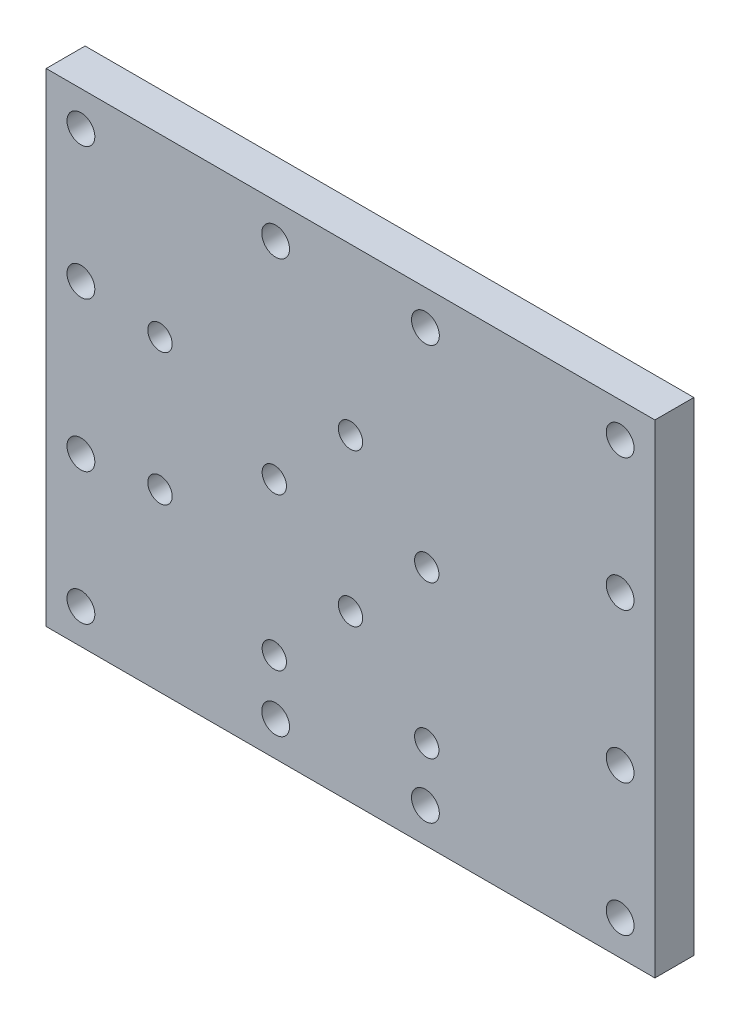
ISO-10303-21;
HEADER;
FILE_DESCRIPTION(('STEP AP214'),'2;1');
FILE_NAME('part.step','',(''),(''),'','','');
FILE_SCHEMA(('AUTOMOTIVE_DESIGN { 1 0 10303 214 1 1 1 1 }'));
ENDSEC;
DATA;
#1=APPLICATION_CONTEXT('core data for automotive mechanical design processes');
#2=APPLICATION_PROTOCOL_DEFINITION('international standard','automotive_design',2000,#1);
#3=PRODUCT_CONTEXT('',#1,'mechanical');
#4=PRODUCT('Part','Part','',(#3));
#5=PRODUCT_RELATED_PRODUCT_CATEGORY('part','',(#4));
#6=PRODUCT_DEFINITION_FORMATION('','',#4);
#7=PRODUCT_DEFINITION_CONTEXT('part definition',#1,'design');
#8=PRODUCT_DEFINITION('design','',#6,#7);
#9=PRODUCT_DEFINITION_SHAPE('','',#8);
#10=(LENGTH_UNIT() NAMED_UNIT(*) SI_UNIT(.MILLI.,.METRE.));
#11=(NAMED_UNIT(*) PLANE_ANGLE_UNIT() SI_UNIT($,.RADIAN.));
#12=(NAMED_UNIT(*) SI_UNIT($,.STERADIAN.) SOLID_ANGLE_UNIT());
#13=UNCERTAINTY_MEASURE_WITH_UNIT(LENGTH_MEASURE(1.E-05),#10,'distance_accuracy_value','');
#14=(GEOMETRIC_REPRESENTATION_CONTEXT(3) GLOBAL_UNCERTAINTY_ASSIGNED_CONTEXT((#13)) GLOBAL_UNIT_ASSIGNED_CONTEXT((#10,
#11,#12)) REPRESENTATION_CONTEXT('',''));
#15=CARTESIAN_POINT('',(0.,0.,0.));
#16=DIRECTION('',(0.,0.,1.));
#17=DIRECTION('',(1.,0.,0.));
#18=AXIS2_PLACEMENT_3D('',#15,#16,#17);
#19=CARTESIAN_POINT('',(0.,0.,3.08959499710472));
#20=DIRECTION('',(0.,0.,-1.));
#21=DIRECTION('',(-1.,0.,0.));
#22=AXIS2_PLACEMENT_3D('',#19,#20,#21);
#23=PLANE('',#22);
#24=CARTESIAN_POINT('',(-112.854312824647,49.0731544247676,3.08959499710472));
#25=DIRECTION('',(0.,0.,1.));
#26=DIRECTION('',(1.,0.,0.));
#27=AXIS2_PLACEMENT_3D('',#24,#25,#26);
#28=CIRCLE('',#27,1.75);
#29=CARTESIAN_POINT('',(-111.104312824647,49.0731544247676,3.08959499710472));
#30=VERTEX_POINT('',#29);
#31=EDGE_CURVE('E223',#30,#30,#28,.T.);
#32=ORIENTED_EDGE('',*,*,#31,.F.);
#33=EDGE_LOOP('',(#32));
#34=FACE_BOUND('',#33,.T.);
#35=CARTESIAN_POINT('',(-90.9343128246472,49.0731544247676,3.08959499710472));
#36=DIRECTION('',(0.,0.,1.));
#37=DIRECTION('',(1.,0.,0.));
#38=AXIS2_PLACEMENT_3D('',#35,#36,#37);
#39=CIRCLE('',#38,1.75);
#40=CARTESIAN_POINT('',(-89.1843128246472,49.0731544247676,3.08959499710472));
#41=VERTEX_POINT('',#40);
#42=EDGE_CURVE('E217',#41,#41,#39,.T.);
#43=ORIENTED_EDGE('',*,*,#42,.F.);
#44=EDGE_LOOP('',(#43));
#45=FACE_BOUND('',#44,.T.);
#46=CARTESIAN_POINT('',(-101.894312824647,81.9531544247676,3.08959499710472));
#47=DIRECTION('',(0.,0.,1.));
#48=DIRECTION('',(1.,0.,0.));
#49=AXIS2_PLACEMENT_3D('',#46,#47,#48);
#50=CIRCLE('',#49,1.75);
#51=CARTESIAN_POINT('',(-100.144312824647,81.9531544247676,3.08959499710472));
#52=VERTEX_POINT('',#51);
#53=EDGE_CURVE('E211',#52,#52,#50,.T.);
#54=ORIENTED_EDGE('',*,*,#53,.F.);
#55=EDGE_LOOP('',(#54));
#56=FACE_BOUND('',#55,.T.);
#57=CARTESIAN_POINT('',(-90.9343128246472,70.9931544247678,3.08959499710472));
#58=DIRECTION('',(0.,0.,1.));
#59=DIRECTION('',(1.,0.,0.));
#60=AXIS2_PLACEMENT_3D('',#57,#58,#59);
#61=CIRCLE('',#60,1.75);
#62=CARTESIAN_POINT('',(-89.1843128246472,70.9931544247678,3.08959499710472));
#63=VERTEX_POINT('',#62);
#64=EDGE_CURVE('E205',#63,#63,#61,.T.);
#65=ORIENTED_EDGE('',*,*,#64,.F.);
#66=EDGE_LOOP('',(#65));
#67=FACE_BOUND('',#66,.T.);
#68=CARTESIAN_POINT('',(-101.894312824647,60.0331544247676,3.08959499710472));
#69=DIRECTION('',(0.,0.,1.));
#70=DIRECTION('',(1.,0.,0.));
#71=AXIS2_PLACEMENT_3D('',#68,#69,#70);
#72=CIRCLE('',#71,1.75);
#73=CARTESIAN_POINT('',(-100.144312824647,60.0331544247676,3.08959499710472));
#74=VERTEX_POINT('',#73);
#75=EDGE_CURVE('E199',#74,#74,#72,.T.);
#76=ORIENTED_EDGE('',*,*,#75,.F.);
#77=EDGE_LOOP('',(#76));
#78=FACE_BOUND('',#77,.T.);
#79=CARTESIAN_POINT('',(-112.854312824647,70.9931544247678,3.08959499710472));
#80=DIRECTION('',(0.,0.,1.));
#81=DIRECTION('',(1.,0.,0.));
#82=AXIS2_PLACEMENT_3D('',#79,#80,#81);
#83=CIRCLE('',#82,1.75);
#84=CARTESIAN_POINT('',(-111.104312824647,70.9931544247678,3.08959499710472));
#85=VERTEX_POINT('',#84);
#86=EDGE_CURVE('E193',#85,#85,#83,.T.);
#87=ORIENTED_EDGE('',*,*,#86,.F.);
#88=EDGE_LOOP('',(#87));
#89=FACE_BOUND('',#88,.T.);
#90=CARTESIAN_POINT('',(-129.295243468411,61.5009786918622,3.08959499710472));
#91=DIRECTION('',(0.,0.,1.));
#92=DIRECTION('',(1.,0.,0.));
#93=AXIS2_PLACEMENT_3D('',#90,#91,#92);
#94=CIRCLE('',#93,1.75000000000001);
#95=CARTESIAN_POINT('',(-127.545243468411,61.5009786918622,3.08959499710472));
#96=VERTEX_POINT('',#95);
#97=EDGE_CURVE('E187',#96,#96,#94,.T.);
#98=ORIENTED_EDGE('',*,*,#97,.F.);
#99=EDGE_LOOP('',(#98));
#100=FACE_BOUND('',#99,.T.);
#101=CARTESIAN_POINT('',(-129.295243468411,80.4853301576721,3.08959499710472));
#102=DIRECTION('',(0.,0.,1.));
#103=DIRECTION('',(1.,0.,0.));
#104=AXIS2_PLACEMENT_3D('',#101,#102,#103);
#105=CIRCLE('',#104,1.75000000000001);
#106=CARTESIAN_POINT('',(-127.545243468411,80.4853301576721,3.08959499710472));
#107=VERTEX_POINT('',#106);
#108=EDGE_CURVE('E181',#107,#107,#105,.T.);
#109=ORIENTED_EDGE('',*,*,#108,.F.);
#110=EDGE_LOOP('',(#109));
#111=FACE_BOUND('',#110,.T.);
#112=CARTESIAN_POINT('',(-112.664312824647,100.741954424767,3.08959499710472));
#113=DIRECTION('',(0.,0.,1.));
#114=DIRECTION('',(1.,0.,0.));
#115=AXIS2_PLACEMENT_3D('',#112,#113,#114);
#116=CIRCLE('',#115,2.);
#117=CARTESIAN_POINT('',(-110.664312824647,100.741954424767,3.08959499710472));
#118=VERTEX_POINT('',#117);
#119=EDGE_CURVE('E169',#118,#118,#116,.T.);
#120=ORIENTED_EDGE('',*,*,#119,.F.);
#121=EDGE_LOOP('',(#120));
#122=FACE_BOUND('',#121,.T.);
#123=CARTESIAN_POINT('',(-140.664312824647,81.7419544247674,3.08959499710472));
#124=DIRECTION('',(0.,0.,1.));
#125=DIRECTION('',(1.,0.,0.));
#126=AXIS2_PLACEMENT_3D('',#123,#124,#125);
#127=CIRCLE('',#126,2.);
#128=CARTESIAN_POINT('',(-138.664312824647,81.7419544247674,3.08959499710472));
#129=VERTEX_POINT('',#128);
#130=EDGE_CURVE('E157',#129,#129,#127,.T.);
#131=ORIENTED_EDGE('',*,*,#130,.F.);
#132=EDGE_LOOP('',(#131));
#133=FACE_BOUND('',#132,.T.);
#134=CARTESIAN_POINT('',(-140.664312824647,41.2443544247679,3.08959499710472));
#135=DIRECTION('',(0.,0.,1.));
#136=DIRECTION('',(1.,0.,0.));
#137=AXIS2_PLACEMENT_3D('',#134,#135,#136);
#138=CIRCLE('',#137,2.);
#139=CARTESIAN_POINT('',(-138.664312824647,41.2443544247679,3.08959499710472));
#140=VERTEX_POINT('',#139);
#141=EDGE_CURVE('E145',#140,#140,#138,.T.);
#142=ORIENTED_EDGE('',*,*,#141,.F.);
#143=EDGE_LOOP('',(#142));
#144=FACE_BOUND('',#143,.T.);
#145=CARTESIAN_POINT('',(-91.1243128246472,41.2443544247679,3.08959499710472));
#146=DIRECTION('',(0.,0.,1.));
#147=DIRECTION('',(1.,0.,0.));
#148=AXIS2_PLACEMENT_3D('',#145,#146,#147);
#149=CIRCLE('',#148,2.);
#150=CARTESIAN_POINT('',(-89.1243128246472,41.2443544247679,3.08959499710472));
#151=VERTEX_POINT('',#150);
#152=EDGE_CURVE('E133',#151,#151,#149,.T.);
#153=ORIENTED_EDGE('',*,*,#152,.F.);
#154=EDGE_LOOP('',(#153));
#155=FACE_BOUND('',#154,.T.);
#156=CARTESIAN_POINT('',(-63.1243128246471,60.2443544247679,3.08959499710472));
#157=DIRECTION('',(0.,0.,1.));
#158=DIRECTION('',(1.,0.,0.));
#159=AXIS2_PLACEMENT_3D('',#156,#157,#158);
#160=CIRCLE('',#159,2.);
#161=CARTESIAN_POINT('',(-61.1243128246471,60.2443544247679,3.08959499710472));
#162=VERTEX_POINT('',#161);
#163=EDGE_CURVE('E121',#162,#162,#160,.T.);
#164=ORIENTED_EDGE('',*,*,#163,.F.);
#165=EDGE_LOOP('',(#164));
#166=FACE_BOUND('',#165,.T.);
#167=CARTESIAN_POINT('',(-63.1243128246472,100.741954424767,3.08959499710472));
#168=DIRECTION('',(0.,0.,1.));
#169=DIRECTION('',(1.,0.,0.));
#170=AXIS2_PLACEMENT_3D('',#167,#168,#169);
#171=CIRCLE('',#170,2.);
#172=CARTESIAN_POINT('',(-61.1243128246472,100.741954424767,3.08959499710472));
#173=VERTEX_POINT('',#172);
#174=EDGE_CURVE('E100',#173,#173,#171,.T.);
#175=ORIENTED_EDGE('',*,*,#174,.F.);
#176=EDGE_LOOP('',(#175));
#177=FACE_BOUND('',#176,.T.);
#178=DIRECTION('',(0.,-1.,0.));
#179=VECTOR('',#178,1.);
#180=CARTESIAN_POINT('',(-145.664312824647,36.2443544247679,3.08959499710472));
#181=LINE('',#180,#179);
#182=CARTESIAN_POINT('',(-145.664312824647,105.741954424767,3.08959499710472));
#183=VERTEX_POINT('',#182);
#184=CARTESIAN_POINT('',(-145.664312824647,36.2443544247679,3.08959499710472));
#185=VERTEX_POINT('',#184);
#186=EDGE_CURVE('E85',#183,#185,#181,.T.);
#187=ORIENTED_EDGE('',*,*,#186,.T.);
#188=DIRECTION('',(1.,0.,0.));
#189=VECTOR('',#188,1.);
#190=CARTESIAN_POINT('',(-145.664312824647,36.2443544247679,3.08959499710472));
#191=LINE('',#190,#189);
#192=CARTESIAN_POINT('',(-58.1243128246472,36.2443544247679,3.08959499710472));
#193=VERTEX_POINT('',#192);
#194=EDGE_CURVE('E80',#185,#193,#191,.T.);
#195=ORIENTED_EDGE('',*,*,#194,.T.);
#196=DIRECTION('',(0.,1.,0.));
#197=VECTOR('',#196,1.);
#198=CARTESIAN_POINT('',(-58.1243128246472,36.2443544247679,3.08959499710472));
#199=LINE('',#198,#197);
#200=CARTESIAN_POINT('',(-58.1243128246472,105.741954424767,3.08959499710472));
#201=VERTEX_POINT('',#200);
#202=EDGE_CURVE('E83',#193,#201,#199,.T.);
#203=ORIENTED_EDGE('',*,*,#202,.T.);
#204=DIRECTION('',(-1.,0.,0.));
#205=VECTOR('',#204,1.);
#206=CARTESIAN_POINT('',(-145.664312824647,105.741954424767,3.08959499710472));
#207=LINE('',#206,#205);
#208=EDGE_CURVE('E50',#201,#183,#207,.T.);
#209=ORIENTED_EDGE('',*,*,#208,.T.);
#210=EDGE_LOOP('',(#187,#195,#203,#209));
#211=FACE_BOUND('',#210,.T.);
#212=CARTESIAN_POINT('',(-63.1243128246471,81.7419544247674,3.08959499710472));
#213=DIRECTION('',(0.,0.,1.));
#214=DIRECTION('',(1.,0.,0.));
#215=AXIS2_PLACEMENT_3D('',#212,#213,#214);
#216=CIRCLE('',#215,2.);
#217=CARTESIAN_POINT('',(-61.1243128246471,81.7419544247674,3.08959499710472));
#218=VERTEX_POINT('',#217);
#219=EDGE_CURVE('E115',#218,#218,#216,.T.);
#220=ORIENTED_EDGE('',*,*,#219,.F.);
#221=EDGE_LOOP('',(#220));
#222=FACE_BOUND('',#221,.T.);
#223=CARTESIAN_POINT('',(-63.1243128246472,41.2443544247679,3.08959499710472));
#224=DIRECTION('',(0.,0.,1.));
#225=DIRECTION('',(1.,0.,0.));
#226=AXIS2_PLACEMENT_3D('',#223,#224,#225);
#227=CIRCLE('',#226,2.);
#228=CARTESIAN_POINT('',(-61.1243128246472,41.2443544247679,3.08959499710472));
#229=VERTEX_POINT('',#228);
#230=EDGE_CURVE('E127',#229,#229,#227,.T.);
#231=ORIENTED_EDGE('',*,*,#230,.F.);
#232=EDGE_LOOP('',(#231));
#233=FACE_BOUND('',#232,.T.);
#234=CARTESIAN_POINT('',(-112.664312824647,41.2443544247679,3.08959499710472));
#235=DIRECTION('',(0.,0.,1.));
#236=DIRECTION('',(1.,0.,0.));
#237=AXIS2_PLACEMENT_3D('',#234,#235,#236);
#238=CIRCLE('',#237,2.);
#239=CARTESIAN_POINT('',(-110.664312824647,41.2443544247679,3.08959499710472));
#240=VERTEX_POINT('',#239);
#241=EDGE_CURVE('E139',#240,#240,#238,.T.);
#242=ORIENTED_EDGE('',*,*,#241,.F.);
#243=EDGE_LOOP('',(#242));
#244=FACE_BOUND('',#243,.T.);
#245=CARTESIAN_POINT('',(-140.664312824647,60.2443544247679,3.08959499710472));
#246=DIRECTION('',(0.,0.,1.));
#247=DIRECTION('',(1.,0.,0.));
#248=AXIS2_PLACEMENT_3D('',#245,#246,#247);
#249=CIRCLE('',#248,2.);
#250=CARTESIAN_POINT('',(-138.664312824647,60.2443544247679,3.08959499710472));
#251=VERTEX_POINT('',#250);
#252=EDGE_CURVE('E151',#251,#251,#249,.T.);
#253=ORIENTED_EDGE('',*,*,#252,.F.);
#254=EDGE_LOOP('',(#253));
#255=FACE_BOUND('',#254,.T.);
#256=CARTESIAN_POINT('',(-140.664312824647,100.741954424767,3.08959499710472));
#257=DIRECTION('',(0.,0.,1.));
#258=DIRECTION('',(1.,0.,0.));
#259=AXIS2_PLACEMENT_3D('',#256,#257,#258);
#260=CIRCLE('',#259,2.);
#261=CARTESIAN_POINT('',(-138.664312824647,100.741954424767,3.08959499710472));
#262=VERTEX_POINT('',#261);
#263=EDGE_CURVE('E163',#262,#262,#260,.T.);
#264=ORIENTED_EDGE('',*,*,#263,.F.);
#265=EDGE_LOOP('',(#264));
#266=FACE_BOUND('',#265,.T.);
#267=CARTESIAN_POINT('',(-91.1243128246472,100.741954424767,3.08959499710472));
#268=DIRECTION('',(0.,0.,1.));
#269=DIRECTION('',(1.,0.,0.));
#270=AXIS2_PLACEMENT_3D('',#267,#268,#269);
#271=CIRCLE('',#270,2.);
#272=CARTESIAN_POINT('',(-89.1243128246472,100.741954424767,3.08959499710472));
#273=VERTEX_POINT('',#272);
#274=EDGE_CURVE('E175',#273,#273,#271,.T.);
#275=ORIENTED_EDGE('',*,*,#274,.F.);
#276=EDGE_LOOP('',(#275));
#277=FACE_BOUND('',#276,.T.);
#278=ADVANCED_FACE('F33',(#34,#45,#56,#67,#78,#89,#100,#111,#122,#133,#144,#155,#166,#177,#211,
#222,#233,#244,#255,#266,#277),#23,.F.);
#279=CARTESIAN_POINT('',(0.,0.,-2.51040500289528));
#280=DIRECTION('',(0.,0.,-1.));
#281=DIRECTION('',(-1.,0.,0.));
#282=AXIS2_PLACEMENT_3D('',#279,#280,#281);
#283=PLANE('',#282);
#284=CARTESIAN_POINT('',(-112.854312824647,49.0731544247676,-2.51040500289528));
#285=DIRECTION('',(0.,0.,-1.));
#286=DIRECTION('',(-1.,0.,0.));
#287=AXIS2_PLACEMENT_3D('',#284,#285,#286);
#288=CIRCLE('',#287,1.75);
#289=CARTESIAN_POINT('',(-114.604312824647,49.0731544247676,-2.51040500289528));
#290=VERTEX_POINT('',#289);
#291=EDGE_CURVE('E226',#290,#290,#288,.F.);
#292=ORIENTED_EDGE('',*,*,#291,.T.);
#293=EDGE_LOOP('',(#292));
#294=FACE_BOUND('',#293,.T.);
#295=CARTESIAN_POINT('',(-90.9343128246472,49.0731544247676,-2.51040500289528));
#296=DIRECTION('',(0.,0.,-1.));
#297=DIRECTION('',(-1.,0.,0.));
#298=AXIS2_PLACEMENT_3D('',#295,#296,#297);
#299=CIRCLE('',#298,1.75);
#300=CARTESIAN_POINT('',(-92.6843128246472,49.0731544247676,-2.51040500289528));
#301=VERTEX_POINT('',#300);
#302=EDGE_CURVE('E220',#301,#301,#299,.F.);
#303=ORIENTED_EDGE('',*,*,#302,.T.);
#304=EDGE_LOOP('',(#303));
#305=FACE_BOUND('',#304,.T.);
#306=CARTESIAN_POINT('',(-101.894312824647,81.9531544247676,-2.51040500289528));
#307=DIRECTION('',(0.,0.,-1.));
#308=DIRECTION('',(-1.,0.,0.));
#309=AXIS2_PLACEMENT_3D('',#306,#307,#308);
#310=CIRCLE('',#309,1.75);
#311=CARTESIAN_POINT('',(-103.644312824647,81.9531544247676,-2.51040500289528));
#312=VERTEX_POINT('',#311);
#313=EDGE_CURVE('E214',#312,#312,#310,.F.);
#314=ORIENTED_EDGE('',*,*,#313,.T.);
#315=EDGE_LOOP('',(#314));
#316=FACE_BOUND('',#315,.T.);
#317=CARTESIAN_POINT('',(-90.9343128246472,70.9931544247678,-2.51040500289528));
#318=DIRECTION('',(0.,0.,-1.));
#319=DIRECTION('',(-1.,0.,0.));
#320=AXIS2_PLACEMENT_3D('',#317,#318,#319);
#321=CIRCLE('',#320,1.75);
#322=CARTESIAN_POINT('',(-92.6843128246472,70.9931544247678,-2.51040500289528));
#323=VERTEX_POINT('',#322);
#324=EDGE_CURVE('E208',#323,#323,#321,.F.);
#325=ORIENTED_EDGE('',*,*,#324,.T.);
#326=EDGE_LOOP('',(#325));
#327=FACE_BOUND('',#326,.T.);
#328=CARTESIAN_POINT('',(-101.894312824647,60.0331544247676,-2.51040500289528));
#329=DIRECTION('',(0.,0.,-1.));
#330=DIRECTION('',(-1.,0.,0.));
#331=AXIS2_PLACEMENT_3D('',#328,#329,#330);
#332=CIRCLE('',#331,1.75);
#333=CARTESIAN_POINT('',(-103.644312824647,60.0331544247676,-2.51040500289528));
#334=VERTEX_POINT('',#333);
#335=EDGE_CURVE('E202',#334,#334,#332,.F.);
#336=ORIENTED_EDGE('',*,*,#335,.T.);
#337=EDGE_LOOP('',(#336));
#338=FACE_BOUND('',#337,.T.);
#339=CARTESIAN_POINT('',(-112.854312824647,70.9931544247678,-2.51040500289528));
#340=DIRECTION('',(0.,0.,-1.));
#341=DIRECTION('',(-1.,0.,0.));
#342=AXIS2_PLACEMENT_3D('',#339,#340,#341);
#343=CIRCLE('',#342,1.75);
#344=CARTESIAN_POINT('',(-114.604312824647,70.9931544247678,-2.51040500289528));
#345=VERTEX_POINT('',#344);
#346=EDGE_CURVE('E196',#345,#345,#343,.F.);
#347=ORIENTED_EDGE('',*,*,#346,.T.);
#348=EDGE_LOOP('',(#347));
#349=FACE_BOUND('',#348,.T.);
#350=CARTESIAN_POINT('',(-129.295243468411,61.5009786918622,-2.51040500289528));
#351=DIRECTION('',(0.,0.,-1.));
#352=DIRECTION('',(-1.,0.,0.));
#353=AXIS2_PLACEMENT_3D('',#350,#351,#352);
#354=CIRCLE('',#353,1.75000000000001);
#355=CARTESIAN_POINT('',(-131.045243468411,61.5009786918622,-2.51040500289528));
#356=VERTEX_POINT('',#355);
#357=EDGE_CURVE('E190',#356,#356,#354,.F.);
#358=ORIENTED_EDGE('',*,*,#357,.T.);
#359=EDGE_LOOP('',(#358));
#360=FACE_BOUND('',#359,.T.);
#361=CARTESIAN_POINT('',(-129.295243468411,80.4853301576721,-2.51040500289528));
#362=DIRECTION('',(0.,0.,-1.));
#363=DIRECTION('',(-1.,0.,0.));
#364=AXIS2_PLACEMENT_3D('',#361,#362,#363);
#365=CIRCLE('',#364,1.75000000000001);
#366=CARTESIAN_POINT('',(-131.045243468411,80.4853301576721,-2.51040500289528));
#367=VERTEX_POINT('',#366);
#368=EDGE_CURVE('E184',#367,#367,#365,.F.);
#369=ORIENTED_EDGE('',*,*,#368,.T.);
#370=EDGE_LOOP('',(#369));
#371=FACE_BOUND('',#370,.T.);
#372=CARTESIAN_POINT('',(-112.664312824647,100.741954424767,-2.51040500289528));
#373=DIRECTION('',(0.,0.,1.));
#374=DIRECTION('',(1.,0.,0.));
#375=AXIS2_PLACEMENT_3D('',#372,#373,#374);
#376=CIRCLE('',#375,2.);
#377=CARTESIAN_POINT('',(-110.664312824647,100.741954424767,-2.51040500289528));
#378=VERTEX_POINT('',#377);
#379=EDGE_CURVE('E172',#378,#378,#376,.T.);
#380=ORIENTED_EDGE('',*,*,#379,.T.);
#381=EDGE_LOOP('',(#380));
#382=FACE_BOUND('',#381,.T.);
#383=CARTESIAN_POINT('',(-140.664312824647,81.7419544247674,-2.51040500289528));
#384=DIRECTION('',(0.,0.,1.));
#385=DIRECTION('',(1.,0.,0.));
#386=AXIS2_PLACEMENT_3D('',#383,#384,#385);
#387=CIRCLE('',#386,2.);
#388=CARTESIAN_POINT('',(-138.664312824647,81.7419544247674,-2.51040500289528));
#389=VERTEX_POINT('',#388);
#390=EDGE_CURVE('E160',#389,#389,#387,.T.);
#391=ORIENTED_EDGE('',*,*,#390,.T.);
#392=EDGE_LOOP('',(#391));
#393=FACE_BOUND('',#392,.T.);
#394=CARTESIAN_POINT('',(-140.664312824647,41.2443544247679,-2.51040500289528));
#395=DIRECTION('',(0.,0.,1.));
#396=DIRECTION('',(1.,0.,0.));
#397=AXIS2_PLACEMENT_3D('',#394,#395,#396);
#398=CIRCLE('',#397,2.);
#399=CARTESIAN_POINT('',(-138.664312824647,41.2443544247679,-2.51040500289528));
#400=VERTEX_POINT('',#399);
#401=EDGE_CURVE('E148',#400,#400,#398,.T.);
#402=ORIENTED_EDGE('',*,*,#401,.T.);
#403=EDGE_LOOP('',(#402));
#404=FACE_BOUND('',#403,.T.);
#405=CARTESIAN_POINT('',(-91.1243128246472,41.2443544247679,-2.51040500289528));
#406=DIRECTION('',(0.,0.,1.));
#407=DIRECTION('',(1.,0.,0.));
#408=AXIS2_PLACEMENT_3D('',#405,#406,#407);
#409=CIRCLE('',#408,2.);
#410=CARTESIAN_POINT('',(-89.1243128246472,41.2443544247679,-2.51040500289528));
#411=VERTEX_POINT('',#410);
#412=EDGE_CURVE('E136',#411,#411,#409,.T.);
#413=ORIENTED_EDGE('',*,*,#412,.T.);
#414=EDGE_LOOP('',(#413));
#415=FACE_BOUND('',#414,.T.);
#416=CARTESIAN_POINT('',(-63.1243128246471,60.2443544247679,-2.51040500289528));
#417=DIRECTION('',(0.,0.,1.));
#418=DIRECTION('',(1.,0.,0.));
#419=AXIS2_PLACEMENT_3D('',#416,#417,#418);
#420=CIRCLE('',#419,2.);
#421=CARTESIAN_POINT('',(-61.1243128246471,60.2443544247679,-2.51040500289528));
#422=VERTEX_POINT('',#421);
#423=EDGE_CURVE('E124',#422,#422,#420,.T.);
#424=ORIENTED_EDGE('',*,*,#423,.T.);
#425=EDGE_LOOP('',(#424));
#426=FACE_BOUND('',#425,.T.);
#427=CARTESIAN_POINT('',(-63.1243128246472,100.741954424767,-2.51040500289528));
#428=DIRECTION('',(0.,0.,1.));
#429=DIRECTION('',(1.,0.,0.));
#430=AXIS2_PLACEMENT_3D('',#427,#428,#429);
#431=CIRCLE('',#430,2.);
#432=CARTESIAN_POINT('',(-61.1243128246472,100.741954424767,-2.51040500289528));
#433=VERTEX_POINT('',#432);
#434=EDGE_CURVE('E112',#433,#433,#431,.T.);
#435=ORIENTED_EDGE('',*,*,#434,.T.);
#436=EDGE_LOOP('',(#435));
#437=FACE_BOUND('',#436,.T.);
#438=DIRECTION('',(0.,-1.,0.));
#439=VECTOR('',#438,1.);
#440=CARTESIAN_POINT('',(-145.664312824647,36.2443544247679,-2.51040500289528));
#441=LINE('',#440,#439);
#442=CARTESIAN_POINT('',(-145.664312824647,105.741954424767,-2.51040500289528));
#443=VERTEX_POINT('',#442);
#444=CARTESIAN_POINT('',(-145.664312824647,36.2443544247679,-2.51040500289528));
#445=VERTEX_POINT('',#444);
#446=EDGE_CURVE('E97',#443,#445,#441,.T.);
#447=ORIENTED_EDGE('',*,*,#446,.F.);
#448=DIRECTION('',(-1.,0.,0.));
#449=VECTOR('',#448,1.);
#450=CARTESIAN_POINT('',(-145.664312824647,105.741954424767,-2.51040500289528));
#451=LINE('',#450,#449);
#452=CARTESIAN_POINT('',(-58.1243128246472,105.741954424767,-2.51040500289528));
#453=VERTEX_POINT('',#452);
#454=EDGE_CURVE('E73',#453,#443,#451,.T.);
#455=ORIENTED_EDGE('',*,*,#454,.F.);
#456=DIRECTION('',(0.,1.,0.));
#457=VECTOR('',#456,1.);
#458=CARTESIAN_POINT('',(-58.1243128246472,36.2443544247679,-2.51040500289528));
#459=LINE('',#458,#457);
#460=CARTESIAN_POINT('',(-58.1243128246472,36.2443544247679,-2.51040500289528));
#461=VERTEX_POINT('',#460);
#462=EDGE_CURVE('E67',#461,#453,#459,.T.);
#463=ORIENTED_EDGE('',*,*,#462,.F.);
#464=DIRECTION('',(1.,0.,0.));
#465=VECTOR('',#464,1.);
#466=CARTESIAN_POINT('',(-145.664312824647,36.2443544247679,-2.51040500289528));
#467=LINE('',#466,#465);
#468=EDGE_CURVE('E89',#445,#461,#467,.T.);
#469=ORIENTED_EDGE('',*,*,#468,.F.);
#470=EDGE_LOOP('',(#447,#455,#463,#469));
#471=FACE_BOUND('',#470,.T.);
#472=CARTESIAN_POINT('',(-63.1243128246471,81.7419544247674,-2.51040500289528));
#473=DIRECTION('',(0.,0.,1.));
#474=DIRECTION('',(1.,0.,0.));
#475=AXIS2_PLACEMENT_3D('',#472,#473,#474);
#476=CIRCLE('',#475,2.);
#477=CARTESIAN_POINT('',(-61.1243128246471,81.7419544247674,-2.51040500289528));
#478=VERTEX_POINT('',#477);
#479=EDGE_CURVE('E118',#478,#478,#476,.T.);
#480=ORIENTED_EDGE('',*,*,#479,.T.);
#481=EDGE_LOOP('',(#480));
#482=FACE_BOUND('',#481,.T.);
#483=CARTESIAN_POINT('',(-63.1243128246472,41.2443544247679,-2.51040500289528));
#484=DIRECTION('',(0.,0.,1.));
#485=DIRECTION('',(1.,0.,0.));
#486=AXIS2_PLACEMENT_3D('',#483,#484,#485);
#487=CIRCLE('',#486,2.);
#488=CARTESIAN_POINT('',(-61.1243128246472,41.2443544247679,-2.51040500289528));
#489=VERTEX_POINT('',#488);
#490=EDGE_CURVE('E130',#489,#489,#487,.T.);
#491=ORIENTED_EDGE('',*,*,#490,.T.);
#492=EDGE_LOOP('',(#491));
#493=FACE_BOUND('',#492,.T.);
#494=CARTESIAN_POINT('',(-112.664312824647,41.2443544247679,-2.51040500289528));
#495=DIRECTION('',(0.,0.,1.));
#496=DIRECTION('',(1.,0.,0.));
#497=AXIS2_PLACEMENT_3D('',#494,#495,#496);
#498=CIRCLE('',#497,2.);
#499=CARTESIAN_POINT('',(-110.664312824647,41.2443544247679,-2.51040500289528));
#500=VERTEX_POINT('',#499);
#501=EDGE_CURVE('E142',#500,#500,#498,.T.);
#502=ORIENTED_EDGE('',*,*,#501,.T.);
#503=EDGE_LOOP('',(#502));
#504=FACE_BOUND('',#503,.T.);
#505=CARTESIAN_POINT('',(-140.664312824647,60.2443544247679,-2.51040500289528));
#506=DIRECTION('',(0.,0.,1.));
#507=DIRECTION('',(1.,0.,0.));
#508=AXIS2_PLACEMENT_3D('',#505,#506,#507);
#509=CIRCLE('',#508,2.);
#510=CARTESIAN_POINT('',(-138.664312824647,60.2443544247679,-2.51040500289528));
#511=VERTEX_POINT('',#510);
#512=EDGE_CURVE('E154',#511,#511,#509,.T.);
#513=ORIENTED_EDGE('',*,*,#512,.T.);
#514=EDGE_LOOP('',(#513));
#515=FACE_BOUND('',#514,.T.);
#516=CARTESIAN_POINT('',(-140.664312824647,100.741954424767,-2.51040500289528));
#517=DIRECTION('',(0.,0.,1.));
#518=DIRECTION('',(1.,0.,0.));
#519=AXIS2_PLACEMENT_3D('',#516,#517,#518);
#520=CIRCLE('',#519,2.);
#521=CARTESIAN_POINT('',(-138.664312824647,100.741954424767,-2.51040500289528));
#522=VERTEX_POINT('',#521);
#523=EDGE_CURVE('E166',#522,#522,#520,.T.);
#524=ORIENTED_EDGE('',*,*,#523,.T.);
#525=EDGE_LOOP('',(#524));
#526=FACE_BOUND('',#525,.T.);
#527=CARTESIAN_POINT('',(-91.1243128246472,100.741954424767,-2.51040500289528));
#528=DIRECTION('',(0.,0.,1.));
#529=DIRECTION('',(1.,0.,0.));
#530=AXIS2_PLACEMENT_3D('',#527,#528,#529);
#531=CIRCLE('',#530,2.);
#532=CARTESIAN_POINT('',(-89.1243128246472,100.741954424767,-2.51040500289528));
#533=VERTEX_POINT('',#532);
#534=EDGE_CURVE('E178',#533,#533,#531,.T.);
#535=ORIENTED_EDGE('',*,*,#534,.T.);
#536=EDGE_LOOP('',(#535));
#537=FACE_BOUND('',#536,.T.);
#538=ADVANCED_FACE('F108',(#294,#305,#316,#327,#338,#349,#360,#371,#382,#393,#404,#415,#426,
#437,#471,#482,#493,#504,#515,#526,#537),#283,.T.);
#539=CARTESIAN_POINT('',(-145.664312824647,36.2443544247679,3.08959499710472));
#540=DIRECTION('',(1.,0.,0.));
#541=DIRECTION('',(0.,0.,-1.));
#542=AXIS2_PLACEMENT_3D('',#539,#540,#541);
#543=PLANE('',#542);
#544=ORIENTED_EDGE('',*,*,#446,.T.);
#545=DIRECTION('',(0.,0.,-1.));
#546=VECTOR('',#545,1.);
#547=CARTESIAN_POINT('',(-145.664312824647,36.2443544247679,3.08959499710472));
#548=LINE('',#547,#546);
#549=EDGE_CURVE('E11',#185,#445,#548,.T.);
#550=ORIENTED_EDGE('',*,*,#549,.F.);
#551=ORIENTED_EDGE('',*,*,#186,.F.);
#552=DIRECTION('',(0.,0.,-1.));
#553=VECTOR('',#552,1.);
#554=CARTESIAN_POINT('',(-145.664312824647,105.741954424767,3.08959499710472));
#555=LINE('',#554,#553);
#556=EDGE_CURVE('E93',#183,#443,#555,.T.);
#557=ORIENTED_EDGE('',*,*,#556,.T.);
#558=EDGE_LOOP('',(#544,#550,#551,#557));
#559=FACE_BOUND('',#558,.T.);
#560=ADVANCED_FACE('F35',(#559),#543,.F.);
#561=CARTESIAN_POINT('',(-145.664312824647,36.2443544247679,3.08959499710472));
#562=DIRECTION('',(0.,1.,0.));
#563=DIRECTION('',(0.,0.,1.));
#564=AXIS2_PLACEMENT_3D('',#561,#562,#563);
#565=PLANE('',#564);
#566=ORIENTED_EDGE('',*,*,#468,.T.);
#567=DIRECTION('',(0.,0.,-1.));
#568=VECTOR('',#567,1.);
#569=CARTESIAN_POINT('',(-58.1243128246472,36.2443544247679,3.08959499710472));
#570=LINE('',#569,#568);
#571=EDGE_CURVE('E42',#193,#461,#570,.T.);
#572=ORIENTED_EDGE('',*,*,#571,.F.);
#573=ORIENTED_EDGE('',*,*,#194,.F.);
#574=ORIENTED_EDGE('',*,*,#549,.T.);
#575=EDGE_LOOP('',(#566,#572,#573,#574));
#576=FACE_BOUND('',#575,.T.);
#577=ADVANCED_FACE('F88',(#576),#565,.F.);
#578=CARTESIAN_POINT('',(-58.1243128246472,36.2443544247679,3.08959499710472));
#579=DIRECTION('',(-1.,0.,0.));
#580=DIRECTION('',(0.,0.,1.));
#581=AXIS2_PLACEMENT_3D('',#578,#579,#580);
#582=PLANE('',#581);
#583=ORIENTED_EDGE('',*,*,#462,.T.);
#584=DIRECTION('',(0.,0.,-1.));
#585=VECTOR('',#584,1.);
#586=CARTESIAN_POINT('',(-58.1243128246472,105.741954424767,3.08959499710472));
#587=LINE('',#586,#585);
#588=EDGE_CURVE('E90',#201,#453,#587,.T.);
#589=ORIENTED_EDGE('',*,*,#588,.F.);
#590=ORIENTED_EDGE('',*,*,#202,.F.);
#591=ORIENTED_EDGE('',*,*,#571,.T.);
#592=EDGE_LOOP('',(#583,#589,#590,#591));
#593=FACE_BOUND('',#592,.T.);
#594=ADVANCED_FACE('F91',(#593),#582,.F.);
#595=CARTESIAN_POINT('',(-145.664312824647,105.741954424767,3.08959499710472));
#596=DIRECTION('',(0.,-1.,0.));
#597=DIRECTION('',(0.,0.,-1.));
#598=AXIS2_PLACEMENT_3D('',#595,#596,#597);
#599=PLANE('',#598);
#600=ORIENTED_EDGE('',*,*,#454,.T.);
#601=ORIENTED_EDGE('',*,*,#556,.F.);
#602=ORIENTED_EDGE('',*,*,#208,.F.);
#603=ORIENTED_EDGE('',*,*,#588,.T.);
#604=EDGE_LOOP('',(#600,#601,#602,#603));
#605=FACE_BOUND('',#604,.T.);
#606=ADVANCED_FACE('F105',(#605),#599,.F.);
#607=CARTESIAN_POINT('',(-63.1243128246472,100.741954424767,3.08959499710472));
#608=DIRECTION('',(0.,0.,-1.));
#609=DIRECTION('',(-1.,0.,0.));
#610=AXIS2_PLACEMENT_3D('',#607,#608,#609);
#611=CYLINDRICAL_SURFACE('',#610,2.);
#612=ORIENTED_EDGE('',*,*,#174,.T.);
#613=EDGE_LOOP('',(#612));
#614=FACE_BOUND('',#613,.T.);
#615=ORIENTED_EDGE('',*,*,#434,.F.);
#616=EDGE_LOOP('',(#615));
#617=FACE_BOUND('',#616,.T.);
#618=ADVANCED_FACE('F263',(#614,#617),#611,.F.);
#619=CARTESIAN_POINT('',(-63.1243128246471,81.7419544247674,3.08959499710472));
#620=DIRECTION('',(0.,0.,-1.));
#621=DIRECTION('',(-1.,0.,0.));
#622=AXIS2_PLACEMENT_3D('',#619,#620,#621);
#623=CYLINDRICAL_SURFACE('',#622,2.);
#624=ORIENTED_EDGE('',*,*,#219,.T.);
#625=EDGE_LOOP('',(#624));
#626=FACE_BOUND('',#625,.T.);
#627=ORIENTED_EDGE('',*,*,#479,.F.);
#628=EDGE_LOOP('',(#627));
#629=FACE_BOUND('',#628,.T.);
#630=ADVANCED_FACE('F266',(#626,#629),#623,.F.);
#631=CARTESIAN_POINT('',(-63.1243128246471,60.2443544247679,3.08959499710472));
#632=DIRECTION('',(0.,0.,-1.));
#633=DIRECTION('',(-1.,0.,0.));
#634=AXIS2_PLACEMENT_3D('',#631,#632,#633);
#635=CYLINDRICAL_SURFACE('',#634,2.);
#636=ORIENTED_EDGE('',*,*,#163,.T.);
#637=EDGE_LOOP('',(#636));
#638=FACE_BOUND('',#637,.T.);
#639=ORIENTED_EDGE('',*,*,#423,.F.);
#640=EDGE_LOOP('',(#639));
#641=FACE_BOUND('',#640,.T.);
#642=ADVANCED_FACE('F308',(#638,#641),#635,.F.);
#643=CARTESIAN_POINT('',(-63.1243128246472,41.2443544247679,3.08959499710472));
#644=DIRECTION('',(0.,0.,-1.));
#645=DIRECTION('',(-1.,0.,0.));
#646=AXIS2_PLACEMENT_3D('',#643,#644,#645);
#647=CYLINDRICAL_SURFACE('',#646,2.);
#648=ORIENTED_EDGE('',*,*,#230,.T.);
#649=EDGE_LOOP('',(#648));
#650=FACE_BOUND('',#649,.T.);
#651=ORIENTED_EDGE('',*,*,#490,.F.);
#652=EDGE_LOOP('',(#651));
#653=FACE_BOUND('',#652,.T.);
#654=ADVANCED_FACE('F317',(#650,#653),#647,.F.);
#655=CARTESIAN_POINT('',(-91.1243128246472,41.2443544247679,3.08959499710472));
#656=DIRECTION('',(0.,0.,-1.));
#657=DIRECTION('',(-1.,0.,0.));
#658=AXIS2_PLACEMENT_3D('',#655,#656,#657);
#659=CYLINDRICAL_SURFACE('',#658,2.);
#660=ORIENTED_EDGE('',*,*,#152,.T.);
#661=EDGE_LOOP('',(#660));
#662=FACE_BOUND('',#661,.T.);
#663=ORIENTED_EDGE('',*,*,#412,.F.);
#664=EDGE_LOOP('',(#663));
#665=FACE_BOUND('',#664,.T.);
#666=ADVANCED_FACE('F326',(#662,#665),#659,.F.);
#667=CARTESIAN_POINT('',(-112.664312824647,41.2443544247679,3.08959499710472));
#668=DIRECTION('',(0.,0.,-1.));
#669=DIRECTION('',(-1.,0.,0.));
#670=AXIS2_PLACEMENT_3D('',#667,#668,#669);
#671=CYLINDRICAL_SURFACE('',#670,2.);
#672=ORIENTED_EDGE('',*,*,#241,.T.);
#673=EDGE_LOOP('',(#672));
#674=FACE_BOUND('',#673,.T.);
#675=ORIENTED_EDGE('',*,*,#501,.F.);
#676=EDGE_LOOP('',(#675));
#677=FACE_BOUND('',#676,.T.);
#678=ADVANCED_FACE('F335',(#674,#677),#671,.F.);
#679=CARTESIAN_POINT('',(-140.664312824647,41.2443544247679,3.08959499710472));
#680=DIRECTION('',(0.,0.,-1.));
#681=DIRECTION('',(-1.,0.,0.));
#682=AXIS2_PLACEMENT_3D('',#679,#680,#681);
#683=CYLINDRICAL_SURFACE('',#682,2.);
#684=ORIENTED_EDGE('',*,*,#141,.T.);
#685=EDGE_LOOP('',(#684));
#686=FACE_BOUND('',#685,.T.);
#687=ORIENTED_EDGE('',*,*,#401,.F.);
#688=EDGE_LOOP('',(#687));
#689=FACE_BOUND('',#688,.T.);
#690=ADVANCED_FACE('F344',(#686,#689),#683,.F.);
#691=CARTESIAN_POINT('',(-140.664312824647,60.2443544247679,3.08959499710472));
#692=DIRECTION('',(0.,0.,-1.));
#693=DIRECTION('',(-1.,0.,0.));
#694=AXIS2_PLACEMENT_3D('',#691,#692,#693);
#695=CYLINDRICAL_SURFACE('',#694,2.);
#696=ORIENTED_EDGE('',*,*,#252,.T.);
#697=EDGE_LOOP('',(#696));
#698=FACE_BOUND('',#697,.T.);
#699=ORIENTED_EDGE('',*,*,#512,.F.);
#700=EDGE_LOOP('',(#699));
#701=FACE_BOUND('',#700,.T.);
#702=ADVANCED_FACE('F353',(#698,#701),#695,.F.);
#703=CARTESIAN_POINT('',(-140.664312824647,81.7419544247674,3.08959499710472));
#704=DIRECTION('',(0.,0.,-1.));
#705=DIRECTION('',(-1.,0.,0.));
#706=AXIS2_PLACEMENT_3D('',#703,#704,#705);
#707=CYLINDRICAL_SURFACE('',#706,2.);
#708=ORIENTED_EDGE('',*,*,#130,.T.);
#709=EDGE_LOOP('',(#708));
#710=FACE_BOUND('',#709,.T.);
#711=ORIENTED_EDGE('',*,*,#390,.F.);
#712=EDGE_LOOP('',(#711));
#713=FACE_BOUND('',#712,.T.);
#714=ADVANCED_FACE('F362',(#710,#713),#707,.F.);
#715=CARTESIAN_POINT('',(-140.664312824647,100.741954424767,3.08959499710472));
#716=DIRECTION('',(0.,0.,-1.));
#717=DIRECTION('',(-1.,0.,0.));
#718=AXIS2_PLACEMENT_3D('',#715,#716,#717);
#719=CYLINDRICAL_SURFACE('',#718,2.);
#720=ORIENTED_EDGE('',*,*,#263,.T.);
#721=EDGE_LOOP('',(#720));
#722=FACE_BOUND('',#721,.T.);
#723=ORIENTED_EDGE('',*,*,#523,.F.);
#724=EDGE_LOOP('',(#723));
#725=FACE_BOUND('',#724,.T.);
#726=ADVANCED_FACE('F371',(#722,#725),#719,.F.);
#727=CARTESIAN_POINT('',(-112.664312824647,100.741954424767,3.08959499710472));
#728=DIRECTION('',(0.,0.,-1.));
#729=DIRECTION('',(-1.,0.,0.));
#730=AXIS2_PLACEMENT_3D('',#727,#728,#729);
#731=CYLINDRICAL_SURFACE('',#730,2.);
#732=ORIENTED_EDGE('',*,*,#119,.T.);
#733=EDGE_LOOP('',(#732));
#734=FACE_BOUND('',#733,.T.);
#735=ORIENTED_EDGE('',*,*,#379,.F.);
#736=EDGE_LOOP('',(#735));
#737=FACE_BOUND('',#736,.T.);
#738=ADVANCED_FACE('F380',(#734,#737),#731,.F.);
#739=CARTESIAN_POINT('',(-91.1243128246472,100.741954424767,3.08959499710472));
#740=DIRECTION('',(0.,0.,-1.));
#741=DIRECTION('',(-1.,0.,0.));
#742=AXIS2_PLACEMENT_3D('',#739,#740,#741);
#743=CYLINDRICAL_SURFACE('',#742,2.);
#744=ORIENTED_EDGE('',*,*,#274,.T.);
#745=EDGE_LOOP('',(#744));
#746=FACE_BOUND('',#745,.T.);
#747=ORIENTED_EDGE('',*,*,#534,.F.);
#748=EDGE_LOOP('',(#747));
#749=FACE_BOUND('',#748,.T.);
#750=ADVANCED_FACE('F389',(#746,#749),#743,.F.);
#751=CARTESIAN_POINT('',(-129.295243468411,80.4853301576721,-11.1114050028953));
#752=DIRECTION('',(0.,0.,1.));
#753=DIRECTION('',(1.,0.,0.));
#754=AXIS2_PLACEMENT_3D('',#751,#752,#753);
#755=CYLINDRICAL_SURFACE('',#754,1.75000000000001);
#756=ORIENTED_EDGE('',*,*,#368,.F.);
#757=EDGE_LOOP('',(#756));
#758=FACE_BOUND('',#757,.T.);
#759=ORIENTED_EDGE('',*,*,#108,.T.);
#760=EDGE_LOOP('',(#759));
#761=FACE_BOUND('',#760,.T.);
#762=ADVANCED_FACE('F398',(#758,#761),#755,.F.);
#763=CARTESIAN_POINT('',(-129.295243468411,61.5009786918622,-11.1114050028953));
#764=DIRECTION('',(0.,0.,1.));
#765=DIRECTION('',(1.,0.,0.));
#766=AXIS2_PLACEMENT_3D('',#763,#764,#765);
#767=CYLINDRICAL_SURFACE('',#766,1.75000000000001);
#768=ORIENTED_EDGE('',*,*,#357,.F.);
#769=EDGE_LOOP('',(#768));
#770=FACE_BOUND('',#769,.T.);
#771=ORIENTED_EDGE('',*,*,#97,.T.);
#772=EDGE_LOOP('',(#771));
#773=FACE_BOUND('',#772,.T.);
#774=ADVANCED_FACE('F407',(#770,#773),#767,.F.);
#775=CARTESIAN_POINT('',(-112.854312824647,70.9931544247678,-11.1114050028953));
#776=DIRECTION('',(0.,0.,1.));
#777=DIRECTION('',(1.,0.,0.));
#778=AXIS2_PLACEMENT_3D('',#775,#776,#777);
#779=CYLINDRICAL_SURFACE('',#778,1.75);
#780=ORIENTED_EDGE('',*,*,#346,.F.);
#781=EDGE_LOOP('',(#780));
#782=FACE_BOUND('',#781,.T.);
#783=ORIENTED_EDGE('',*,*,#86,.T.);
#784=EDGE_LOOP('',(#783));
#785=FACE_BOUND('',#784,.T.);
#786=ADVANCED_FACE('F416',(#782,#785),#779,.F.);
#787=CARTESIAN_POINT('',(-101.894312824647,60.0331544247676,-11.1114050028953));
#788=DIRECTION('',(0.,0.,1.));
#789=DIRECTION('',(1.,0.,0.));
#790=AXIS2_PLACEMENT_3D('',#787,#788,#789);
#791=CYLINDRICAL_SURFACE('',#790,1.75);
#792=ORIENTED_EDGE('',*,*,#335,.F.);
#793=EDGE_LOOP('',(#792));
#794=FACE_BOUND('',#793,.T.);
#795=ORIENTED_EDGE('',*,*,#75,.T.);
#796=EDGE_LOOP('',(#795));
#797=FACE_BOUND('',#796,.T.);
#798=ADVANCED_FACE('F425',(#794,#797),#791,.F.);
#799=CARTESIAN_POINT('',(-90.9343128246472,70.9931544247678,-11.1114050028953));
#800=DIRECTION('',(0.,0.,1.));
#801=DIRECTION('',(1.,0.,0.));
#802=AXIS2_PLACEMENT_3D('',#799,#800,#801);
#803=CYLINDRICAL_SURFACE('',#802,1.75);
#804=ORIENTED_EDGE('',*,*,#324,.F.);
#805=EDGE_LOOP('',(#804));
#806=FACE_BOUND('',#805,.T.);
#807=ORIENTED_EDGE('',*,*,#64,.T.);
#808=EDGE_LOOP('',(#807));
#809=FACE_BOUND('',#808,.T.);
#810=ADVANCED_FACE('F434',(#806,#809),#803,.F.);
#811=CARTESIAN_POINT('',(-101.894312824647,81.9531544247676,-11.1114050028953));
#812=DIRECTION('',(0.,0.,1.));
#813=DIRECTION('',(1.,0.,0.));
#814=AXIS2_PLACEMENT_3D('',#811,#812,#813);
#815=CYLINDRICAL_SURFACE('',#814,1.75);
#816=ORIENTED_EDGE('',*,*,#313,.F.);
#817=EDGE_LOOP('',(#816));
#818=FACE_BOUND('',#817,.T.);
#819=ORIENTED_EDGE('',*,*,#53,.T.);
#820=EDGE_LOOP('',(#819));
#821=FACE_BOUND('',#820,.T.);
#822=ADVANCED_FACE('F443',(#818,#821),#815,.F.);
#823=CARTESIAN_POINT('',(-90.9343128246472,49.0731544247676,-11.1114050028953));
#824=DIRECTION('',(0.,0.,1.));
#825=DIRECTION('',(1.,0.,0.));
#826=AXIS2_PLACEMENT_3D('',#823,#824,#825);
#827=CYLINDRICAL_SURFACE('',#826,1.75);
#828=ORIENTED_EDGE('',*,*,#302,.F.);
#829=EDGE_LOOP('',(#828));
#830=FACE_BOUND('',#829,.T.);
#831=ORIENTED_EDGE('',*,*,#42,.T.);
#832=EDGE_LOOP('',(#831));
#833=FACE_BOUND('',#832,.T.);
#834=ADVANCED_FACE('F452',(#830,#833),#827,.F.);
#835=CARTESIAN_POINT('',(-112.854312824647,49.0731544247676,-11.1114050028953));
#836=DIRECTION('',(0.,0.,1.));
#837=DIRECTION('',(1.,0.,0.));
#838=AXIS2_PLACEMENT_3D('',#835,#836,#837);
#839=CYLINDRICAL_SURFACE('',#838,1.75);
#840=ORIENTED_EDGE('',*,*,#291,.F.);
#841=EDGE_LOOP('',(#840));
#842=FACE_BOUND('',#841,.T.);
#843=ORIENTED_EDGE('',*,*,#31,.T.);
#844=EDGE_LOOP('',(#843));
#845=FACE_BOUND('',#844,.T.);
#846=ADVANCED_FACE('F232',(#842,#845),#839,.F.);
#847=CLOSED_SHELL('',(#278,#538,#560,#577,#594,#606,#618,#630,#642,#654,#666,#678,#690,#702,
#714,#726,#738,#750,#762,#774,#786,#798,#810,#822,#834,#846));
#848=MANIFOLD_SOLID_BREP('B2',#847);
#849=ADVANCED_BREP_SHAPE_REPRESENTATION('',(#18,#848),#14);
#850=SHAPE_DEFINITION_REPRESENTATION(#9,#849);
ENDSEC;
END-ISO-10303-21;
